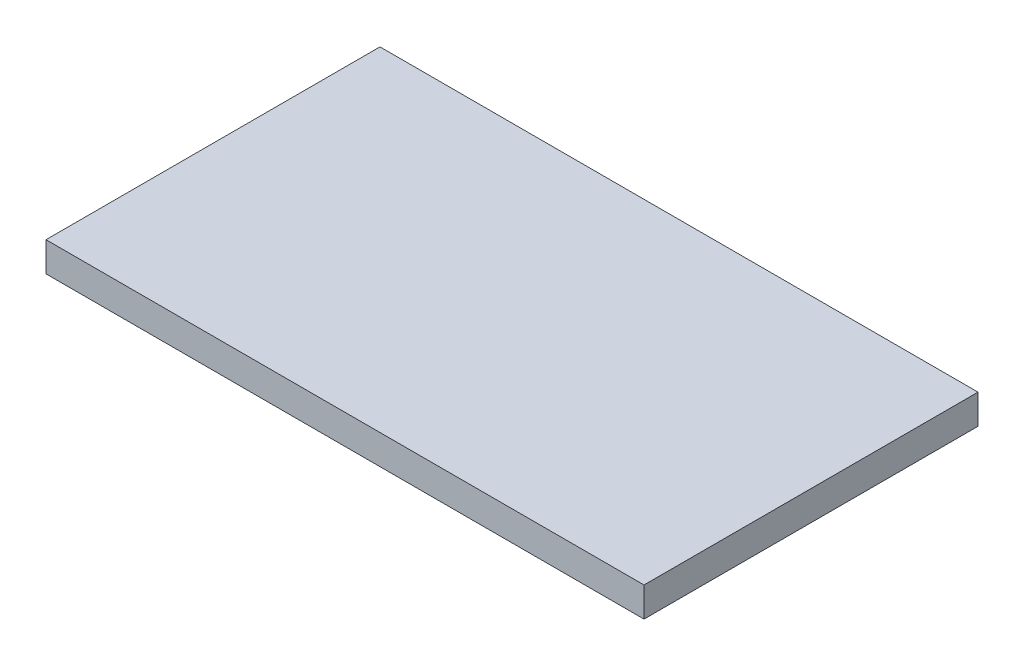
ISO-10303-21;
HEADER;
FILE_DESCRIPTION(('STEP AP214'),'2;1');
FILE_NAME('part.step','',(''),(''),'','','');
FILE_SCHEMA(('AUTOMOTIVE_DESIGN { 1 0 10303 214 1 1 1 1 }'));
ENDSEC;
DATA;
#1=APPLICATION_CONTEXT('core data for automotive mechanical design processes');
#2=APPLICATION_PROTOCOL_DEFINITION('international standard','automotive_design',2000,#1);
#3=PRODUCT_CONTEXT('',#1,'mechanical');
#4=PRODUCT('Part','Part','',(#3));
#5=PRODUCT_RELATED_PRODUCT_CATEGORY('part','',(#4));
#6=PRODUCT_DEFINITION_FORMATION('','',#4);
#7=PRODUCT_DEFINITION_CONTEXT('part definition',#1,'design');
#8=PRODUCT_DEFINITION('design','',#6,#7);
#9=PRODUCT_DEFINITION_SHAPE('','',#8);
#10=(LENGTH_UNIT() NAMED_UNIT(*) SI_UNIT(.MILLI.,.METRE.));
#11=(NAMED_UNIT(*) PLANE_ANGLE_UNIT() SI_UNIT($,.RADIAN.));
#12=(NAMED_UNIT(*) SI_UNIT($,.STERADIAN.) SOLID_ANGLE_UNIT());
#13=UNCERTAINTY_MEASURE_WITH_UNIT(LENGTH_MEASURE(1.E-05),#10,'distance_accuracy_value','');
#14=(GEOMETRIC_REPRESENTATION_CONTEXT(3) GLOBAL_UNCERTAINTY_ASSIGNED_CONTEXT((#13)) GLOBAL_UNIT_ASSIGNED_CONTEXT((#10,
#11,#12)) REPRESENTATION_CONTEXT('',''));
#15=CARTESIAN_POINT('',(0.,0.,0.));
#16=DIRECTION('',(0.,0.,1.));
#17=DIRECTION('',(1.,0.,0.));
#18=AXIS2_PLACEMENT_3D('',#15,#16,#17);
#19=CARTESIAN_POINT('',(0.,0.,0.));
#20=DIRECTION('',(0.,0.,1.));
#21=DIRECTION('',(1.,0.,0.));
#22=AXIS2_PLACEMENT_3D('',#19,#20,#21);
#23=PLANE('',#22);
#24=DIRECTION('',(0.,-1.,0.));
#25=VECTOR('',#24,1.);
#26=CARTESIAN_POINT('',(202.337523687804,0.,0.));
#27=LINE('',#26,#25);
#28=CARTESIAN_POINT('',(202.337523687804,-33.1,0.));
#29=VERTEX_POINT('',#28);
#30=CARTESIAN_POINT('',(202.337523687804,-53.1314680617709,0.));
#31=VERTEX_POINT('',#30);
#32=EDGE_CURVE('E83',#29,#31,#27,.T.);
#33=ORIENTED_EDGE('',*,*,#32,.T.);
#34=DIRECTION('',(1.,0.,0.));
#35=VECTOR('',#34,1.);
#36=CARTESIAN_POINT('',(0.,-53.1314680617709,0.));
#37=LINE('',#36,#35);
#38=CARTESIAN_POINT('',(-202.337265555267,-53.1314680617709,0.));
#39=VERTEX_POINT('',#38);
#40=EDGE_CURVE('E94',#39,#31,#37,.T.);
#41=ORIENTED_EDGE('',*,*,#40,.F.);
#42=DIRECTION('',(0.,-1.,0.));
#43=VECTOR('',#42,1.);
#44=CARTESIAN_POINT('',(-202.337265555267,0.,0.));
#45=LINE('',#44,#43);
#46=CARTESIAN_POINT('',(-202.337265555267,-33.1,0.));
#47=VERTEX_POINT('',#46);
#48=EDGE_CURVE('E92',#47,#39,#45,.T.);
#49=ORIENTED_EDGE('',*,*,#48,.F.);
#50=DIRECTION('',(1.,0.,0.));
#51=VECTOR('',#50,1.);
#52=CARTESIAN_POINT('',(0.,-33.1,0.));
#53=LINE('',#52,#51);
#54=EDGE_CURVE('E78',#47,#29,#53,.T.);
#55=ORIENTED_EDGE('',*,*,#54,.T.);
#56=EDGE_LOOP('',(#33,#41,#49,#55));
#57=FACE_BOUND('',#56,.T.);
#58=ADVANCED_FACE('F37',(#57),#23,.F.);
#59=CARTESIAN_POINT('',(0.,-53.1314680617709,631.17026638394));
#60=DIRECTION('',(0.,1.,0.));
#61=DIRECTION('',(-1.,0.,0.));
#62=AXIS2_PLACEMENT_3D('',#59,#60,#61);
#63=PLANE('',#62);
#64=DIRECTION('',(0.,0.,-1.));
#65=VECTOR('',#64,1.);
#66=CARTESIAN_POINT('',(202.337523687804,-53.1314680617709,631.17026638394));
#67=LINE('',#66,#65);
#68=CARTESIAN_POINT('',(202.337523687804,-53.1314680617709,226.));
#69=VERTEX_POINT('',#68);
#70=EDGE_CURVE('E85',#69,#31,#67,.T.);
#71=ORIENTED_EDGE('',*,*,#70,.F.);
#72=DIRECTION('',(-1.,0.,0.));
#73=VECTOR('',#72,1.);
#74=CARTESIAN_POINT('',(0.,-53.1314680617709,226.));
#75=LINE('',#74,#73);
#76=CARTESIAN_POINT('',(-202.337265555267,-53.1314680617709,226.));
#77=VERTEX_POINT('',#76);
#78=EDGE_CURVE('E41',#69,#77,#75,.T.);
#79=ORIENTED_EDGE('',*,*,#78,.T.);
#80=DIRECTION('',(0.,0.,-1.));
#81=VECTOR('',#80,1.);
#82=CARTESIAN_POINT('',(-202.337265555267,-53.1314680617709,631.17026638394));
#83=LINE('',#82,#81);
#84=EDGE_CURVE('E99',#77,#39,#83,.T.);
#85=ORIENTED_EDGE('',*,*,#84,.T.);
#86=ORIENTED_EDGE('',*,*,#40,.T.);
#87=EDGE_LOOP('',(#71,#79,#85,#86));
#88=FACE_BOUND('',#87,.T.);
#89=ADVANCED_FACE('F110',(#88),#63,.F.);
#90=CARTESIAN_POINT('',(-202.337265555267,0.,631.17026638394));
#91=DIRECTION('',(1.,0.,0.));
#92=DIRECTION('',(0.,0.,-1.));
#93=AXIS2_PLACEMENT_3D('',#90,#91,#92);
#94=PLANE('',#93);
#95=ORIENTED_EDGE('',*,*,#84,.F.);
#96=DIRECTION('',(0.,1.,0.));
#97=VECTOR('',#96,1.);
#98=CARTESIAN_POINT('',(-202.337265555267,0.,226.));
#99=LINE('',#98,#97);
#100=CARTESIAN_POINT('',(-202.337265555267,-33.1,226.));
#101=VERTEX_POINT('',#100);
#102=EDGE_CURVE('E105',#77,#101,#99,.T.);
#103=ORIENTED_EDGE('',*,*,#102,.T.);
#104=DIRECTION('',(0.,0.,-1.));
#105=VECTOR('',#104,1.);
#106=CARTESIAN_POINT('',(-202.337265555267,-33.1,631.17026638394));
#107=LINE('',#106,#105);
#108=EDGE_CURVE('E81',#101,#47,#107,.T.);
#109=ORIENTED_EDGE('',*,*,#108,.T.);
#110=ORIENTED_EDGE('',*,*,#48,.T.);
#111=EDGE_LOOP('',(#95,#103,#109,#110));
#112=FACE_BOUND('',#111,.T.);
#113=ADVANCED_FACE('F104',(#112),#94,.F.);
#114=CARTESIAN_POINT('',(0.,-33.1,631.17026638394));
#115=DIRECTION('',(0.,1.,0.));
#116=DIRECTION('',(0.,0.,1.));
#117=AXIS2_PLACEMENT_3D('',#114,#115,#116);
#118=PLANE('',#117);
#119=DIRECTION('',(-1.,0.,0.));
#120=VECTOR('',#119,1.);
#121=CARTESIAN_POINT('',(0.,-33.1,226.));
#122=LINE('',#121,#120);
#123=CARTESIAN_POINT('',(202.337523687804,-33.1,226.));
#124=VERTEX_POINT('',#123);
#125=EDGE_CURVE('E47',#124,#101,#122,.T.);
#126=ORIENTED_EDGE('',*,*,#125,.F.);
#127=DIRECTION('',(0.,0.,-1.));
#128=VECTOR('',#127,1.);
#129=CARTESIAN_POINT('',(202.337523687804,-33.1,631.17026638394));
#130=LINE('',#129,#128);
#131=EDGE_CURVE('E74',#124,#29,#130,.T.);
#132=ORIENTED_EDGE('',*,*,#131,.T.);
#133=ORIENTED_EDGE('',*,*,#54,.F.);
#134=ORIENTED_EDGE('',*,*,#108,.F.);
#135=EDGE_LOOP('',(#126,#132,#133,#134));
#136=FACE_BOUND('',#135,.T.);
#137=ADVANCED_FACE('F76',(#136),#118,.T.);
#138=CARTESIAN_POINT('',(202.337523687804,0.,631.17026638394));
#139=DIRECTION('',(1.,0.,0.));
#140=DIRECTION('',(0.,0.,-1.));
#141=AXIS2_PLACEMENT_3D('',#138,#139,#140);
#142=PLANE('',#141);
#143=DIRECTION('',(0.,1.,0.));
#144=VECTOR('',#143,1.);
#145=CARTESIAN_POINT('',(202.337523687804,0.,226.));
#146=LINE('',#145,#144);
#147=EDGE_CURVE('E11',#69,#124,#146,.T.);
#148=ORIENTED_EDGE('',*,*,#147,.F.);
#149=ORIENTED_EDGE('',*,*,#70,.T.);
#150=ORIENTED_EDGE('',*,*,#32,.F.);
#151=ORIENTED_EDGE('',*,*,#131,.F.);
#152=EDGE_LOOP('',(#148,#149,#150,#151));
#153=FACE_BOUND('',#152,.T.);
#154=ADVANCED_FACE('F39',(#153),#142,.T.);
#155=CARTESIAN_POINT('',(0.,0.,226.));
#156=DIRECTION('',(0.,0.,-1.));
#157=DIRECTION('',(-1.,0.,0.));
#158=AXIS2_PLACEMENT_3D('',#155,#156,#157);
#159=PLANE('',#158);
#160=ORIENTED_EDGE('',*,*,#147,.T.);
#161=ORIENTED_EDGE('',*,*,#125,.T.);
#162=ORIENTED_EDGE('',*,*,#102,.F.);
#163=ORIENTED_EDGE('',*,*,#78,.F.);
#164=EDGE_LOOP('',(#160,#161,#162,#163));
#165=FACE_BOUND('',#164,.T.);
#166=ADVANCED_FACE('F111',(#165),#159,.F.);
#167=CLOSED_SHELL('',(#58,#89,#113,#137,#154,#166));
#168=MANIFOLD_SOLID_BREP('B2',#167);
#169=ADVANCED_BREP_SHAPE_REPRESENTATION('',(#18,#168),#14);
#170=SHAPE_DEFINITION_REPRESENTATION(#9,#169);
ENDSEC;
END-ISO-10303-21;
